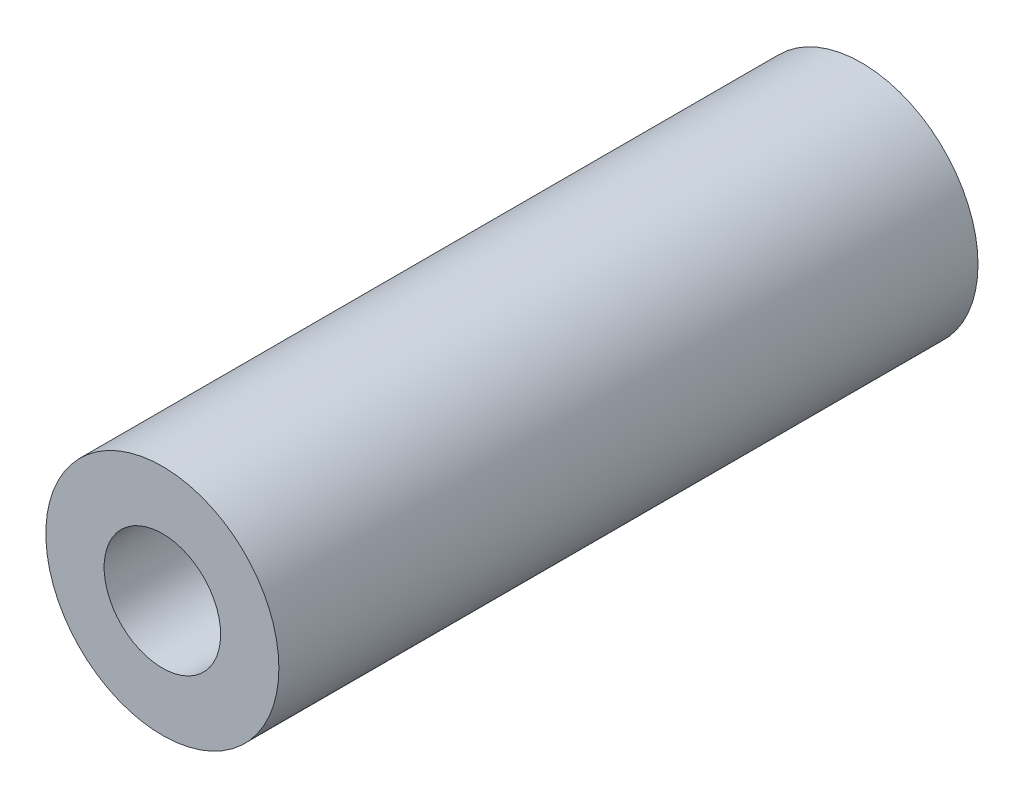
ISO-10303-21;
HEADER;
FILE_DESCRIPTION(('STEP AP214'),'2;1');
FILE_NAME('part.step','',(''),(''),'','','');
FILE_SCHEMA(('AUTOMOTIVE_DESIGN { 1 0 10303 214 1 1 1 1 }'));
ENDSEC;
DATA;
#1=APPLICATION_CONTEXT('core data for automotive mechanical design processes');
#2=APPLICATION_PROTOCOL_DEFINITION('international standard','automotive_design',2000,#1);
#3=PRODUCT_CONTEXT('',#1,'mechanical');
#4=PRODUCT('Part','Part','',(#3));
#5=PRODUCT_RELATED_PRODUCT_CATEGORY('part','',(#4));
#6=PRODUCT_DEFINITION_FORMATION('','',#4);
#7=PRODUCT_DEFINITION_CONTEXT('part definition',#1,'design');
#8=PRODUCT_DEFINITION('design','',#6,#7);
#9=PRODUCT_DEFINITION_SHAPE('','',#8);
#10=(LENGTH_UNIT() NAMED_UNIT(*) SI_UNIT(.MILLI.,.METRE.));
#11=(NAMED_UNIT(*) PLANE_ANGLE_UNIT() SI_UNIT($,.RADIAN.));
#12=(NAMED_UNIT(*) SI_UNIT($,.STERADIAN.) SOLID_ANGLE_UNIT());
#13=UNCERTAINTY_MEASURE_WITH_UNIT(LENGTH_MEASURE(1.E-05),#10,'distance_accuracy_value','');
#14=(GEOMETRIC_REPRESENTATION_CONTEXT(3) GLOBAL_UNCERTAINTY_ASSIGNED_CONTEXT((#13)) GLOBAL_UNIT_ASSIGNED_CONTEXT((#10,
#11,#12)) REPRESENTATION_CONTEXT('',''));
#15=CARTESIAN_POINT('',(0.,0.,0.));
#16=DIRECTION('',(0.,0.,1.));
#17=DIRECTION('',(1.,0.,0.));
#18=AXIS2_PLACEMENT_3D('',#15,#16,#17);
#19=CARTESIAN_POINT('',(-32.5,171.471148242576,15.));
#20=DIRECTION('',(0.,0.,1.));
#21=DIRECTION('',(1.,0.,0.));
#22=AXIS2_PLACEMENT_3D('',#19,#20,#21);
#23=PLANE('',#22);
#24=CARTESIAN_POINT('',(-32.5,171.471148242576,15.));
#25=DIRECTION('',(0.,0.,1.));
#26=DIRECTION('',(1.,0.,0.));
#27=AXIS2_PLACEMENT_3D('',#24,#25,#26);
#28=CIRCLE('',#27,2.5);
#29=CARTESIAN_POINT('',(-30.,171.471148242576,15.));
#30=VERTEX_POINT('',#29);
#31=EDGE_CURVE('E10',#30,#30,#28,.T.);
#32=ORIENTED_EDGE('',*,*,#31,.T.);
#33=EDGE_LOOP('',(#32));
#34=FACE_BOUND('',#33,.T.);
#35=CARTESIAN_POINT('',(-32.5,171.471148242576,15.));
#36=DIRECTION('',(0.,0.,1.));
#37=DIRECTION('',(1.,0.,0.));
#38=AXIS2_PLACEMENT_3D('',#35,#36,#37);
#39=CIRCLE('',#38,1.25);
#40=CARTESIAN_POINT('',(-31.25,171.471148242576,15.));
#41=VERTEX_POINT('',#40);
#42=EDGE_CURVE('E42',#41,#41,#39,.T.);
#43=ORIENTED_EDGE('',*,*,#42,.F.);
#44=EDGE_LOOP('',(#43));
#45=FACE_BOUND('',#44,.T.);
#46=ADVANCED_FACE('F31',(#34,#45),#23,.T.);
#47=CARTESIAN_POINT('',(-32.5,171.471148242576,0.));
#48=DIRECTION('',(0.,0.,1.));
#49=DIRECTION('',(1.,0.,0.));
#50=AXIS2_PLACEMENT_3D('',#47,#48,#49);
#51=PLANE('',#50);
#52=CARTESIAN_POINT('',(-32.5,171.471148242576,0.));
#53=DIRECTION('',(0.,0.,1.));
#54=DIRECTION('',(1.,0.,0.));
#55=AXIS2_PLACEMENT_3D('',#52,#53,#54);
#56=CIRCLE('',#55,2.5);
#57=CARTESIAN_POINT('',(-30.,171.471148242576,0.));
#58=VERTEX_POINT('',#57);
#59=EDGE_CURVE('E35',#58,#58,#56,.T.);
#60=ORIENTED_EDGE('',*,*,#59,.F.);
#61=EDGE_LOOP('',(#60));
#62=FACE_BOUND('',#61,.T.);
#63=CARTESIAN_POINT('',(-32.5,171.471148242576,0.));
#64=DIRECTION('',(0.,0.,1.));
#65=DIRECTION('',(1.,0.,0.));
#66=AXIS2_PLACEMENT_3D('',#63,#64,#65);
#67=CIRCLE('',#66,1.25);
#68=CARTESIAN_POINT('',(-31.25,171.471148242576,0.));
#69=VERTEX_POINT('',#68);
#70=EDGE_CURVE('E44',#69,#69,#67,.T.);
#71=ORIENTED_EDGE('',*,*,#70,.T.);
#72=EDGE_LOOP('',(#71));
#73=FACE_BOUND('',#72,.T.);
#74=ADVANCED_FACE('F54',(#62,#73),#51,.F.);
#75=CARTESIAN_POINT('',(-32.5,171.471148242576,15.));
#76=DIRECTION('',(0.,0.,-1.));
#77=DIRECTION('',(-1.,0.,0.));
#78=AXIS2_PLACEMENT_3D('',#75,#76,#77);
#79=CYLINDRICAL_SURFACE('',#78,2.5);
#80=ORIENTED_EDGE('',*,*,#31,.F.);
#81=EDGE_LOOP('',(#80));
#82=FACE_BOUND('',#81,.T.);
#83=ORIENTED_EDGE('',*,*,#59,.T.);
#84=EDGE_LOOP('',(#83));
#85=FACE_BOUND('',#84,.T.);
#86=ADVANCED_FACE('F33',(#82,#85),#79,.T.);
#87=CARTESIAN_POINT('',(-32.5,171.471148242576,15.));
#88=DIRECTION('',(0.,0.,-1.));
#89=DIRECTION('',(-1.,0.,0.));
#90=AXIS2_PLACEMENT_3D('',#87,#88,#89);
#91=CYLINDRICAL_SURFACE('',#90,1.25);
#92=ORIENTED_EDGE('',*,*,#42,.T.);
#93=EDGE_LOOP('',(#92));
#94=FACE_BOUND('',#93,.T.);
#95=ORIENTED_EDGE('',*,*,#70,.F.);
#96=EDGE_LOOP('',(#95));
#97=FACE_BOUND('',#96,.T.);
#98=ADVANCED_FACE('F50',(#94,#97),#91,.F.);
#99=CLOSED_SHELL('',(#46,#74,#86,#98));
#100=MANIFOLD_SOLID_BREP('B2',#99);
#101=ADVANCED_BREP_SHAPE_REPRESENTATION('',(#18,#100),#14);
#102=SHAPE_DEFINITION_REPRESENTATION(#9,#101);
ENDSEC;
END-ISO-10303-21;
